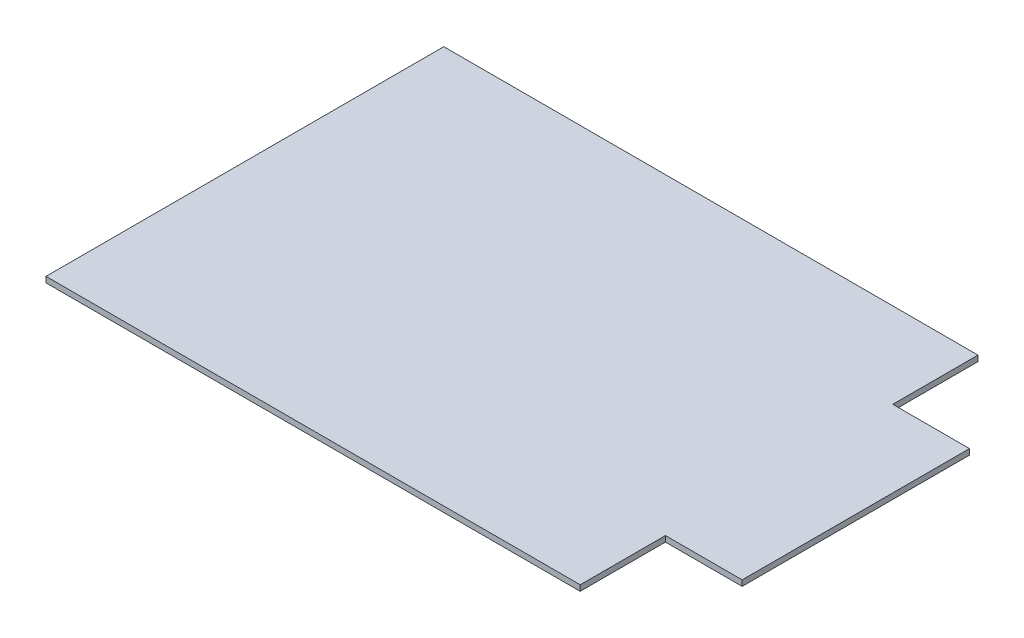
ISO-10303-21;
HEADER;
FILE_DESCRIPTION(('STEP AP214'),'2;1');
FILE_NAME('part.step','',(''),(''),'','','');
FILE_SCHEMA(('AUTOMOTIVE_DESIGN { 1 0 10303 214 1 1 1 1 }'));
ENDSEC;
DATA;
#1=APPLICATION_CONTEXT('core data for automotive mechanical design processes');
#2=APPLICATION_PROTOCOL_DEFINITION('international standard','automotive_design',2000,#1);
#3=PRODUCT_CONTEXT('',#1,'mechanical');
#4=PRODUCT('Part','Part','',(#3));
#5=PRODUCT_RELATED_PRODUCT_CATEGORY('part','',(#4));
#6=PRODUCT_DEFINITION_FORMATION('','',#4);
#7=PRODUCT_DEFINITION_CONTEXT('part definition',#1,'design');
#8=PRODUCT_DEFINITION('design','',#6,#7);
#9=PRODUCT_DEFINITION_SHAPE('','',#8);
#10=(LENGTH_UNIT() NAMED_UNIT(*) SI_UNIT(.MILLI.,.METRE.));
#11=(NAMED_UNIT(*) PLANE_ANGLE_UNIT() SI_UNIT($,.RADIAN.));
#12=(NAMED_UNIT(*) SI_UNIT($,.STERADIAN.) SOLID_ANGLE_UNIT());
#13=UNCERTAINTY_MEASURE_WITH_UNIT(LENGTH_MEASURE(1.E-05),#10,'distance_accuracy_value','');
#14=(GEOMETRIC_REPRESENTATION_CONTEXT(3) GLOBAL_UNCERTAINTY_ASSIGNED_CONTEXT((#13)) GLOBAL_UNIT_ASSIGNED_CONTEXT((#10,
#11,#12)) REPRESENTATION_CONTEXT('',''));
#15=CARTESIAN_POINT('',(0.,0.,0.));
#16=DIRECTION('',(0.,0.,1.));
#17=DIRECTION('',(1.,0.,0.));
#18=AXIS2_PLACEMENT_3D('',#15,#16,#17);
#19=CARTESIAN_POINT('',(132.795335459798,2.,-60.4756963075932));
#20=DIRECTION('',(0.,0.,1.));
#21=DIRECTION('',(1.,0.,0.));
#22=AXIS2_PLACEMENT_3D('',#19,#20,#21);
#23=PLANE('',#22);
#24=DIRECTION('',(-1.,0.,0.));
#25=VECTOR('',#24,1.);
#26=CARTESIAN_POINT('',(132.795335459798,0.,-60.4756963075932));
#27=LINE('',#26,#25);
#28=CARTESIAN_POINT('',(132.795335459798,0.,-60.4756963075932));
#29=VERTEX_POINT('',#28);
#30=CARTESIAN_POINT('',(-55.2046645402019,0.,-60.4756963075931));
#31=VERTEX_POINT('',#30);
#32=EDGE_CURVE('E140',#29,#31,#27,.T.);
#33=ORIENTED_EDGE('',*,*,#32,.T.);
#34=DIRECTION('',(0.,-1.,0.));
#35=VECTOR('',#34,1.);
#36=CARTESIAN_POINT('',(-55.2046645402019,2.,-60.4756963075931));
#37=LINE('',#36,#35);
#38=CARTESIAN_POINT('',(-55.2046645402019,2.,-60.4756963075931));
#39=VERTEX_POINT('',#38);
#40=EDGE_CURVE('E11',#39,#31,#37,.T.);
#41=ORIENTED_EDGE('',*,*,#40,.F.);
#42=DIRECTION('',(-1.,0.,0.));
#43=VECTOR('',#42,1.);
#44=CARTESIAN_POINT('',(132.795335459798,2.,-60.4756963075932));
#45=LINE('',#44,#43);
#46=CARTESIAN_POINT('',(132.795335459798,2.,-60.4756963075932));
#47=VERTEX_POINT('',#46);
#48=EDGE_CURVE('E162',#47,#39,#45,.T.);
#49=ORIENTED_EDGE('',*,*,#48,.F.);
#50=DIRECTION('',(0.,-1.,0.));
#51=VECTOR('',#50,1.);
#52=CARTESIAN_POINT('',(132.795335459798,2.,-60.4756963075932));
#53=LINE('',#52,#51);
#54=EDGE_CURVE('E136',#47,#29,#53,.T.);
#55=ORIENTED_EDGE('',*,*,#54,.T.);
#56=EDGE_LOOP('',(#33,#41,#49,#55));
#57=FACE_BOUND('',#56,.T.);
#58=ADVANCED_FACE('F39',(#57),#23,.F.);
#59=CARTESIAN_POINT('',(-55.2046645402019,2.,-60.4756963075931));
#60=DIRECTION('',(1.,0.,0.));
#61=DIRECTION('',(0.,0.,-1.));
#62=AXIS2_PLACEMENT_3D('',#59,#60,#61);
#63=PLANE('',#62);
#64=DIRECTION('',(0.,0.,1.));
#65=VECTOR('',#64,1.);
#66=CARTESIAN_POINT('',(-55.2046645402019,0.,-60.4756963075931));
#67=LINE('',#66,#65);
#68=CARTESIAN_POINT('',(-55.2046645402018,0.,79.5243036924068));
#69=VERTEX_POINT('',#68);
#70=EDGE_CURVE('E144',#31,#69,#67,.T.);
#71=ORIENTED_EDGE('',*,*,#70,.T.);
#72=DIRECTION('',(0.,-1.,0.));
#73=VECTOR('',#72,1.);
#74=CARTESIAN_POINT('',(-55.2046645402018,2.,79.5243036924068));
#75=LINE('',#74,#73);
#76=CARTESIAN_POINT('',(-55.2046645402018,2.,79.5243036924068));
#77=VERTEX_POINT('',#76);
#78=EDGE_CURVE('E48',#77,#69,#75,.T.);
#79=ORIENTED_EDGE('',*,*,#78,.F.);
#80=DIRECTION('',(0.,0.,1.));
#81=VECTOR('',#80,1.);
#82=CARTESIAN_POINT('',(-55.2046645402019,2.,-60.4756963075931));
#83=LINE('',#82,#81);
#84=EDGE_CURVE('E99',#39,#77,#83,.T.);
#85=ORIENTED_EDGE('',*,*,#84,.F.);
#86=ORIENTED_EDGE('',*,*,#40,.T.);
#87=EDGE_LOOP('',(#71,#79,#85,#86));
#88=FACE_BOUND('',#87,.T.);
#89=ADVANCED_FACE('F208',(#88),#63,.F.);
#90=CARTESIAN_POINT('',(-55.2046645402018,2.,79.5243036924068));
#91=DIRECTION('',(0.,0.,-1.));
#92=DIRECTION('',(-1.,0.,0.));
#93=AXIS2_PLACEMENT_3D('',#90,#91,#92);
#94=PLANE('',#93);
#95=DIRECTION('',(1.,0.,0.));
#96=VECTOR('',#95,1.);
#97=CARTESIAN_POINT('',(-55.2046645402018,0.,79.5243036924068));
#98=LINE('',#97,#96);
#99=CARTESIAN_POINT('',(132.795335459798,0.,79.5243036924068));
#100=VERTEX_POINT('',#99);
#101=EDGE_CURVE('E147',#69,#100,#98,.T.);
#102=ORIENTED_EDGE('',*,*,#101,.T.);
#103=DIRECTION('',(0.,-1.,0.));
#104=VECTOR('',#103,1.);
#105=CARTESIAN_POINT('',(132.795335459798,2.,79.5243036924068));
#106=LINE('',#105,#104);
#107=CARTESIAN_POINT('',(132.795335459798,2.,79.5243036924068));
#108=VERTEX_POINT('',#107);
#109=EDGE_CURVE('E173',#108,#100,#106,.T.);
#110=ORIENTED_EDGE('',*,*,#109,.F.);
#111=DIRECTION('',(1.,0.,0.));
#112=VECTOR('',#111,1.);
#113=CARTESIAN_POINT('',(-55.2046645402018,2.,79.5243036924068));
#114=LINE('',#113,#112);
#115=EDGE_CURVE('E183',#77,#108,#114,.T.);
#116=ORIENTED_EDGE('',*,*,#115,.F.);
#117=ORIENTED_EDGE('',*,*,#78,.T.);
#118=EDGE_LOOP('',(#102,#110,#116,#117));
#119=FACE_BOUND('',#118,.T.);
#120=ADVANCED_FACE('F181',(#119),#94,.F.);
#121=CARTESIAN_POINT('',(132.795335459798,2.,79.5243036924068));
#122=DIRECTION('',(-1.,0.,0.));
#123=DIRECTION('',(0.,0.,1.));
#124=AXIS2_PLACEMENT_3D('',#121,#122,#123);
#125=PLANE('',#124);
#126=DIRECTION('',(0.,0.,-1.));
#127=VECTOR('',#126,1.);
#128=CARTESIAN_POINT('',(132.795335459798,0.,79.5243036924068));
#129=LINE('',#128,#127);
#130=CARTESIAN_POINT('',(132.795335459798,0.,49.5243036924068));
#131=VERTEX_POINT('',#130);
#132=EDGE_CURVE('E150',#100,#131,#129,.T.);
#133=ORIENTED_EDGE('',*,*,#132,.T.);
#134=DIRECTION('',(0.,-1.,0.));
#135=VECTOR('',#134,1.);
#136=CARTESIAN_POINT('',(132.795335459798,2.,49.5243036924068));
#137=LINE('',#136,#135);
#138=CARTESIAN_POINT('',(132.795335459798,2.,49.5243036924068));
#139=VERTEX_POINT('',#138);
#140=EDGE_CURVE('E169',#139,#131,#137,.T.);
#141=ORIENTED_EDGE('',*,*,#140,.F.);
#142=DIRECTION('',(0.,0.,-1.));
#143=VECTOR('',#142,1.);
#144=CARTESIAN_POINT('',(132.795335459798,2.,79.5243036924068));
#145=LINE('',#144,#143);
#146=EDGE_CURVE('E196',#108,#139,#145,.T.);
#147=ORIENTED_EDGE('',*,*,#146,.F.);
#148=ORIENTED_EDGE('',*,*,#109,.T.);
#149=EDGE_LOOP('',(#133,#141,#147,#148));
#150=FACE_BOUND('',#149,.T.);
#151=ADVANCED_FACE('F191',(#150),#125,.F.);
#152=CARTESIAN_POINT('',(132.795335459798,2.,49.5243036924068));
#153=DIRECTION('',(0.,0.,-1.));
#154=DIRECTION('',(-1.,0.,0.));
#155=AXIS2_PLACEMENT_3D('',#152,#153,#154);
#156=PLANE('',#155);
#157=DIRECTION('',(1.,0.,0.));
#158=VECTOR('',#157,1.);
#159=CARTESIAN_POINT('',(132.795335459798,0.,49.5243036924068));
#160=LINE('',#159,#158);
#161=CARTESIAN_POINT('',(159.795335459798,0.,49.5243036924068));
#162=VERTEX_POINT('',#161);
#163=EDGE_CURVE('E153',#131,#162,#160,.T.);
#164=ORIENTED_EDGE('',*,*,#163,.T.);
#165=DIRECTION('',(0.,-1.,0.));
#166=VECTOR('',#165,1.);
#167=CARTESIAN_POINT('',(159.795335459798,2.,49.5243036924068));
#168=LINE('',#167,#166);
#169=CARTESIAN_POINT('',(159.795335459798,2.,49.5243036924068));
#170=VERTEX_POINT('',#169);
#171=EDGE_CURVE('E129',#170,#162,#168,.T.);
#172=ORIENTED_EDGE('',*,*,#171,.F.);
#173=DIRECTION('',(1.,0.,0.));
#174=VECTOR('',#173,1.);
#175=CARTESIAN_POINT('',(132.795335459798,2.,49.5243036924068));
#176=LINE('',#175,#174);
#177=EDGE_CURVE('E118',#139,#170,#176,.T.);
#178=ORIENTED_EDGE('',*,*,#177,.F.);
#179=ORIENTED_EDGE('',*,*,#140,.T.);
#180=EDGE_LOOP('',(#164,#172,#178,#179));
#181=FACE_BOUND('',#180,.T.);
#182=ADVANCED_FACE('F194',(#181),#156,.F.);
#183=CARTESIAN_POINT('',(159.795335459798,2.,49.5243036924068));
#184=DIRECTION('',(-1.,0.,0.));
#185=DIRECTION('',(0.,0.,1.));
#186=AXIS2_PLACEMENT_3D('',#183,#184,#185);
#187=PLANE('',#186);
#188=DIRECTION('',(0.,0.,-1.));
#189=VECTOR('',#188,1.);
#190=CARTESIAN_POINT('',(159.795335459798,0.,49.5243036924068));
#191=LINE('',#190,#189);
#192=CARTESIAN_POINT('',(159.795335459798,0.,-30.4756963075932));
#193=VERTEX_POINT('',#192);
#194=EDGE_CURVE('E127',#162,#193,#191,.T.);
#195=ORIENTED_EDGE('',*,*,#194,.T.);
#196=DIRECTION('',(0.,-1.,0.));
#197=VECTOR('',#196,1.);
#198=CARTESIAN_POINT('',(159.795335459798,2.,-30.4756963075932));
#199=LINE('',#198,#197);
#200=CARTESIAN_POINT('',(159.795335459798,2.,-30.4756963075932));
#201=VERTEX_POINT('',#200);
#202=EDGE_CURVE('E124',#201,#193,#199,.T.);
#203=ORIENTED_EDGE('',*,*,#202,.F.);
#204=DIRECTION('',(0.,0.,-1.));
#205=VECTOR('',#204,1.);
#206=CARTESIAN_POINT('',(159.795335459798,2.,49.5243036924068));
#207=LINE('',#206,#205);
#208=EDGE_CURVE('E112',#170,#201,#207,.T.);
#209=ORIENTED_EDGE('',*,*,#208,.F.);
#210=ORIENTED_EDGE('',*,*,#171,.T.);
#211=EDGE_LOOP('',(#195,#203,#209,#210));
#212=FACE_BOUND('',#211,.T.);
#213=ADVANCED_FACE('F125',(#212),#187,.F.);
#214=CARTESIAN_POINT('',(159.795335459798,2.,-30.4756963075932));
#215=DIRECTION('',(0.,0.,1.));
#216=DIRECTION('',(1.,0.,0.));
#217=AXIS2_PLACEMENT_3D('',#214,#215,#216);
#218=PLANE('',#217);
#219=DIRECTION('',(-1.,0.,0.));
#220=VECTOR('',#219,1.);
#221=CARTESIAN_POINT('',(159.795335459798,0.,-30.4756963075932));
#222=LINE('',#221,#220);
#223=CARTESIAN_POINT('',(132.795335459798,0.,-30.4756963075932));
#224=VERTEX_POINT('',#223);
#225=EDGE_CURVE('E85',#193,#224,#222,.T.);
#226=ORIENTED_EDGE('',*,*,#225,.T.);
#227=DIRECTION('',(0.,-1.,0.));
#228=VECTOR('',#227,1.);
#229=CARTESIAN_POINT('',(132.795335459798,2.,-30.4756963075932));
#230=LINE('',#229,#228);
#231=CARTESIAN_POINT('',(132.795335459798,2.,-30.4756963075932));
#232=VERTEX_POINT('',#231);
#233=EDGE_CURVE('E130',#232,#224,#230,.T.);
#234=ORIENTED_EDGE('',*,*,#233,.F.);
#235=DIRECTION('',(-1.,0.,0.));
#236=VECTOR('',#235,1.);
#237=CARTESIAN_POINT('',(159.795335459798,2.,-30.4756963075932));
#238=LINE('',#237,#236);
#239=EDGE_CURVE('E116',#201,#232,#238,.T.);
#240=ORIENTED_EDGE('',*,*,#239,.F.);
#241=ORIENTED_EDGE('',*,*,#202,.T.);
#242=EDGE_LOOP('',(#226,#234,#240,#241));
#243=FACE_BOUND('',#242,.T.);
#244=ADVANCED_FACE('F132',(#243),#218,.F.);
#245=CARTESIAN_POINT('',(132.795335459798,2.,-30.4756963075932));
#246=DIRECTION('',(-1.,0.,0.));
#247=DIRECTION('',(0.,0.,1.));
#248=AXIS2_PLACEMENT_3D('',#245,#246,#247);
#249=PLANE('',#248);
#250=DIRECTION('',(0.,0.,-1.));
#251=VECTOR('',#250,1.);
#252=CARTESIAN_POINT('',(132.795335459798,0.,-30.4756963075932));
#253=LINE('',#252,#251);
#254=EDGE_CURVE('E91',#224,#29,#253,.T.);
#255=ORIENTED_EDGE('',*,*,#254,.T.);
#256=ORIENTED_EDGE('',*,*,#54,.F.);
#257=DIRECTION('',(0.,0.,-1.));
#258=VECTOR('',#257,1.);
#259=CARTESIAN_POINT('',(132.795335459798,2.,-30.4756963075932));
#260=LINE('',#259,#258);
#261=EDGE_CURVE('E56',#232,#47,#260,.T.);
#262=ORIENTED_EDGE('',*,*,#261,.F.);
#263=ORIENTED_EDGE('',*,*,#233,.T.);
#264=EDGE_LOOP('',(#255,#256,#262,#263));
#265=FACE_BOUND('',#264,.T.);
#266=ADVANCED_FACE('F224',(#265),#249,.F.);
#267=CARTESIAN_POINT('',(0.,2.,0.));
#268=DIRECTION('',(0.,1.,0.));
#269=DIRECTION('',(0.,0.,1.));
#270=AXIS2_PLACEMENT_3D('',#267,#268,#269);
#271=PLANE('',#270);
#272=ORIENTED_EDGE('',*,*,#48,.T.);
#273=ORIENTED_EDGE('',*,*,#84,.T.);
#274=ORIENTED_EDGE('',*,*,#115,.T.);
#275=ORIENTED_EDGE('',*,*,#146,.T.);
#276=ORIENTED_EDGE('',*,*,#177,.T.);
#277=ORIENTED_EDGE('',*,*,#208,.T.);
#278=ORIENTED_EDGE('',*,*,#239,.T.);
#279=ORIENTED_EDGE('',*,*,#261,.T.);
#280=EDGE_LOOP('',(#272,#273,#274,#275,#276,#277,#278,#279));
#281=FACE_BOUND('',#280,.T.);
#282=ADVANCED_FACE('F114',(#281),#271,.T.);
#283=CARTESIAN_POINT('',(0.,0.,0.));
#284=DIRECTION('',(0.,1.,0.));
#285=DIRECTION('',(0.,0.,1.));
#286=AXIS2_PLACEMENT_3D('',#283,#284,#285);
#287=PLANE('',#286);
#288=ORIENTED_EDGE('',*,*,#32,.F.);
#289=ORIENTED_EDGE('',*,*,#254,.F.);
#290=ORIENTED_EDGE('',*,*,#225,.F.);
#291=ORIENTED_EDGE('',*,*,#194,.F.);
#292=ORIENTED_EDGE('',*,*,#163,.F.);
#293=ORIENTED_EDGE('',*,*,#132,.F.);
#294=ORIENTED_EDGE('',*,*,#101,.F.);
#295=ORIENTED_EDGE('',*,*,#70,.F.);
#296=EDGE_LOOP('',(#288,#289,#290,#291,#292,#293,#294,#295));
#297=FACE_BOUND('',#296,.T.);
#298=ADVANCED_FACE('F187',(#297),#287,.F.);
#299=CLOSED_SHELL('',(#58,#89,#120,#151,#182,#213,#244,#266,#282,#298));
#300=MANIFOLD_SOLID_BREP('B2',#299);
#301=ADVANCED_BREP_SHAPE_REPRESENTATION('',(#18,#300),#14);
#302=SHAPE_DEFINITION_REPRESENTATION(#9,#301);
ENDSEC;
END-ISO-10303-21;
